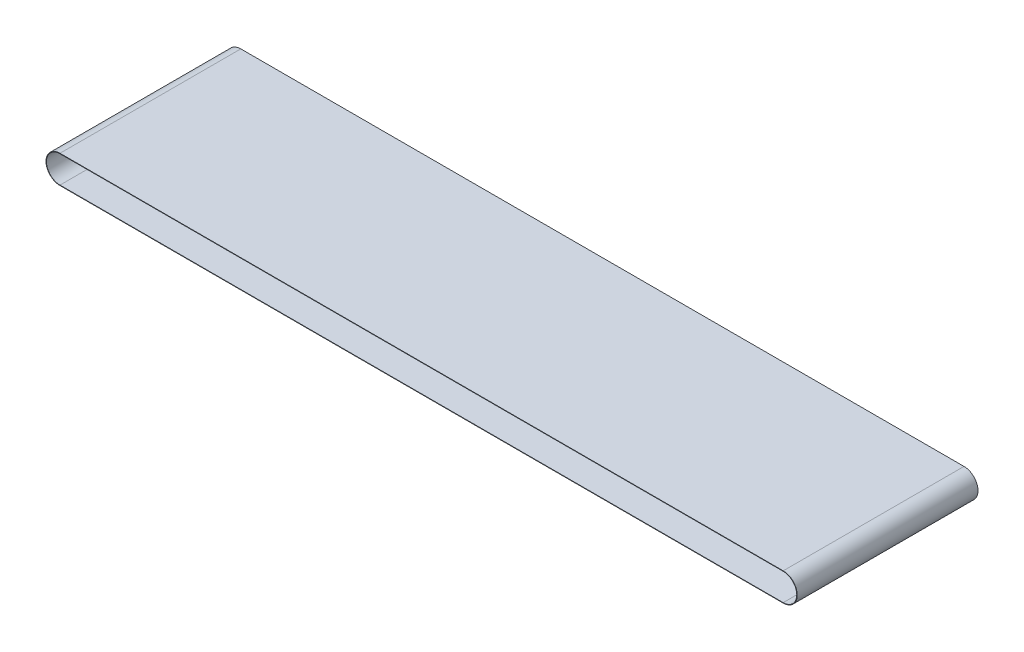
ISO-10303-21;
HEADER;
FILE_DESCRIPTION(('STEP AP214'),'2;1');
FILE_NAME('part.step','',(''),(''),'','','');
FILE_SCHEMA(('AUTOMOTIVE_DESIGN { 1 0 10303 214 1 1 1 1 }'));
ENDSEC;
DATA;
#1=APPLICATION_CONTEXT('core data for automotive mechanical design processes');
#2=APPLICATION_PROTOCOL_DEFINITION('international standard','automotive_design',2000,#1);
#3=PRODUCT_CONTEXT('',#1,'mechanical');
#4=PRODUCT('Part','Part','',(#3));
#5=PRODUCT_RELATED_PRODUCT_CATEGORY('part','',(#4));
#6=PRODUCT_DEFINITION_FORMATION('','',#4);
#7=PRODUCT_DEFINITION_CONTEXT('part definition',#1,'design');
#8=PRODUCT_DEFINITION('design','',#6,#7);
#9=PRODUCT_DEFINITION_SHAPE('','',#8);
#10=(LENGTH_UNIT() NAMED_UNIT(*) SI_UNIT(.MILLI.,.METRE.));
#11=(NAMED_UNIT(*) PLANE_ANGLE_UNIT() SI_UNIT($,.RADIAN.));
#12=(NAMED_UNIT(*) SI_UNIT($,.STERADIAN.) SOLID_ANGLE_UNIT());
#13=UNCERTAINTY_MEASURE_WITH_UNIT(LENGTH_MEASURE(1.E-05),#10,'distance_accuracy_value','');
#14=(GEOMETRIC_REPRESENTATION_CONTEXT(3) GLOBAL_UNCERTAINTY_ASSIGNED_CONTEXT((#13)) GLOBAL_UNIT_ASSIGNED_CONTEXT((#10,
#11,#12)) REPRESENTATION_CONTEXT('',''));
#15=CARTESIAN_POINT('',(0.,0.,0.));
#16=DIRECTION('',(0.,0.,1.));
#17=DIRECTION('',(1.,0.,0.));
#18=AXIS2_PLACEMENT_3D('',#15,#16,#17);
#19=CARTESIAN_POINT('',(0.,0.,250.));
#20=DIRECTION('',(0.,0.,1.));
#21=DIRECTION('',(1.,0.,0.));
#22=AXIS2_PLACEMENT_3D('',#19,#20,#21);
#23=PLANE('',#22);
#24=CARTESIAN_POINT('',(0.,0.,250.));
#25=DIRECTION('',(0.,0.,1.));
#26=DIRECTION('',(1.,0.,0.));
#27=AXIS2_PLACEMENT_3D('',#24,#25,#26);
#28=CIRCLE('',#27,38.7);
#29=CARTESIAN_POINT('',(0.,38.7,250.));
#30=VERTEX_POINT('',#29);
#31=CARTESIAN_POINT('',(0.,-38.7,250.));
#32=VERTEX_POINT('',#31);
#33=EDGE_CURVE('E137',#30,#32,#28,.T.);
#34=ORIENTED_EDGE('',*,*,#33,.T.);
#35=DIRECTION('',(1.,0.,0.));
#36=VECTOR('',#35,1.);
#37=CARTESIAN_POINT('',(0.,-38.7,250.));
#38=LINE('',#37,#36);
#39=CARTESIAN_POINT('',(2000.,-38.7,250.));
#40=VERTEX_POINT('',#39);
#41=EDGE_CURVE('E140',#32,#40,#38,.T.);
#42=ORIENTED_EDGE('',*,*,#41,.T.);
#43=CARTESIAN_POINT('',(2000.,0.,250.));
#44=DIRECTION('',(0.,0.,1.));
#45=DIRECTION('',(1.,0.,0.));
#46=AXIS2_PLACEMENT_3D('',#43,#44,#45);
#47=CIRCLE('',#46,38.7);
#48=CARTESIAN_POINT('',(2000.,38.7,250.));
#49=VERTEX_POINT('',#48);
#50=EDGE_CURVE('E143',#40,#49,#47,.T.);
#51=ORIENTED_EDGE('',*,*,#50,.T.);
#52=DIRECTION('',(-1.,0.,0.));
#53=VECTOR('',#52,1.);
#54=CARTESIAN_POINT('',(0.,38.7,250.));
#55=LINE('',#54,#53);
#56=EDGE_CURVE('E145',#49,#30,#55,.T.);
#57=ORIENTED_EDGE('',*,*,#56,.T.);
#58=EDGE_LOOP('',(#34,#42,#51,#57));
#59=FACE_BOUND('',#58,.T.);
#60=DIRECTION('',(1.,0.,0.));
#61=VECTOR('',#60,1.);
#62=CARTESIAN_POINT('',(0.,-37.5,250.));
#63=LINE('',#62,#61);
#64=CARTESIAN_POINT('',(0.,-37.5,250.));
#65=VERTEX_POINT('',#64);
#66=CARTESIAN_POINT('',(2000.,-37.5,250.));
#67=VERTEX_POINT('',#66);
#68=EDGE_CURVE('E109',#65,#67,#63,.T.);
#69=ORIENTED_EDGE('',*,*,#68,.F.);
#70=CARTESIAN_POINT('',(0.,0.,250.));
#71=DIRECTION('',(0.,0.,1.));
#72=DIRECTION('',(1.,0.,0.));
#73=AXIS2_PLACEMENT_3D('',#70,#71,#72);
#74=CIRCLE('',#73,37.5);
#75=CARTESIAN_POINT('',(0.,37.5,250.));
#76=VERTEX_POINT('',#75);
#77=EDGE_CURVE('E101',#76,#65,#74,.T.);
#78=ORIENTED_EDGE('',*,*,#77,.F.);
#79=DIRECTION('',(-1.,0.,0.));
#80=VECTOR('',#79,1.);
#81=CARTESIAN_POINT('',(0.,37.5,250.));
#82=LINE('',#81,#80);
#83=CARTESIAN_POINT('',(2000.,37.5,250.));
#84=VERTEX_POINT('',#83);
#85=EDGE_CURVE('E123',#84,#76,#82,.T.);
#86=ORIENTED_EDGE('',*,*,#85,.F.);
#87=CARTESIAN_POINT('',(2000.,0.,250.));
#88=DIRECTION('',(0.,0.,1.));
#89=DIRECTION('',(1.,0.,0.));
#90=AXIS2_PLACEMENT_3D('',#87,#88,#89);
#91=CIRCLE('',#90,37.5);
#92=EDGE_CURVE('E121',#67,#84,#91,.T.);
#93=ORIENTED_EDGE('',*,*,#92,.F.);
#94=EDGE_LOOP('',(#69,#78,#86,#93));
#95=FACE_BOUND('',#94,.T.);
#96=ADVANCED_FACE('F36',(#59,#95),#23,.T.);
#97=CARTESIAN_POINT('',(0.,0.,-250.));
#98=DIRECTION('',(0.,0.,1.));
#99=DIRECTION('',(1.,0.,0.));
#100=AXIS2_PLACEMENT_3D('',#97,#98,#99);
#101=PLANE('',#100);
#102=CARTESIAN_POINT('',(0.,0.,-250.));
#103=DIRECTION('',(0.,0.,1.));
#104=DIRECTION('',(1.,0.,0.));
#105=AXIS2_PLACEMENT_3D('',#102,#103,#104);
#106=CIRCLE('',#105,38.7);
#107=CARTESIAN_POINT('',(0.,38.7,-250.));
#108=VERTEX_POINT('',#107);
#109=CARTESIAN_POINT('',(0.,-38.7,-250.));
#110=VERTEX_POINT('',#109);
#111=EDGE_CURVE('E117',#108,#110,#106,.T.);
#112=ORIENTED_EDGE('',*,*,#111,.F.);
#113=DIRECTION('',(-1.,0.,0.));
#114=VECTOR('',#113,1.);
#115=CARTESIAN_POINT('',(0.,38.7,-250.));
#116=LINE('',#115,#114);
#117=CARTESIAN_POINT('',(2000.,38.7,-250.));
#118=VERTEX_POINT('',#117);
#119=EDGE_CURVE('E141',#118,#108,#116,.T.);
#120=ORIENTED_EDGE('',*,*,#119,.F.);
#121=CARTESIAN_POINT('',(2000.,0.,-250.));
#122=DIRECTION('',(0.,0.,1.));
#123=DIRECTION('',(1.,0.,0.));
#124=AXIS2_PLACEMENT_3D('',#121,#122,#123);
#125=CIRCLE('',#124,38.7);
#126=CARTESIAN_POINT('',(2000.,-38.7,-250.));
#127=VERTEX_POINT('',#126);
#128=EDGE_CURVE('E152',#127,#118,#125,.T.);
#129=ORIENTED_EDGE('',*,*,#128,.F.);
#130=DIRECTION('',(1.,0.,0.));
#131=VECTOR('',#130,1.);
#132=CARTESIAN_POINT('',(0.,-38.7,-250.));
#133=LINE('',#132,#131);
#134=EDGE_CURVE('E150',#110,#127,#133,.T.);
#135=ORIENTED_EDGE('',*,*,#134,.F.);
#136=EDGE_LOOP('',(#112,#120,#129,#135));
#137=FACE_BOUND('',#136,.T.);
#138=CARTESIAN_POINT('',(0.,0.,-250.));
#139=DIRECTION('',(0.,0.,1.));
#140=DIRECTION('',(1.,0.,0.));
#141=AXIS2_PLACEMENT_3D('',#138,#139,#140);
#142=CIRCLE('',#141,37.5);
#143=CARTESIAN_POINT('',(0.,37.5,-250.));
#144=VERTEX_POINT('',#143);
#145=CARTESIAN_POINT('',(0.,-37.5,-250.));
#146=VERTEX_POINT('',#145);
#147=EDGE_CURVE('E59',#144,#146,#142,.T.);
#148=ORIENTED_EDGE('',*,*,#147,.T.);
#149=DIRECTION('',(1.,0.,0.));
#150=VECTOR('',#149,1.);
#151=CARTESIAN_POINT('',(0.,-37.5,-250.));
#152=LINE('',#151,#150);
#153=CARTESIAN_POINT('',(2000.,-37.5,-250.));
#154=VERTEX_POINT('',#153);
#155=EDGE_CURVE('E116',#146,#154,#152,.T.);
#156=ORIENTED_EDGE('',*,*,#155,.T.);
#157=CARTESIAN_POINT('',(2000.,0.,-250.));
#158=DIRECTION('',(0.,0.,1.));
#159=DIRECTION('',(1.,0.,0.));
#160=AXIS2_PLACEMENT_3D('',#157,#158,#159);
#161=CIRCLE('',#160,37.5);
#162=CARTESIAN_POINT('',(2000.,37.5,-250.));
#163=VERTEX_POINT('',#162);
#164=EDGE_CURVE('E129',#154,#163,#161,.T.);
#165=ORIENTED_EDGE('',*,*,#164,.T.);
#166=DIRECTION('',(-1.,0.,0.));
#167=VECTOR('',#166,1.);
#168=CARTESIAN_POINT('',(0.,37.5,-250.));
#169=LINE('',#168,#167);
#170=EDGE_CURVE('E110',#163,#144,#169,.T.);
#171=ORIENTED_EDGE('',*,*,#170,.T.);
#172=EDGE_LOOP('',(#148,#156,#165,#171));
#173=FACE_BOUND('',#172,.T.);
#174=ADVANCED_FACE('F170',(#137,#173),#101,.F.);
#175=CARTESIAN_POINT('',(0.,0.,250.));
#176=DIRECTION('',(0.,0.,-1.));
#177=DIRECTION('',(-1.,0.,0.));
#178=AXIS2_PLACEMENT_3D('',#175,#176,#177);
#179=CYLINDRICAL_SURFACE('',#178,38.7);
#180=ORIENTED_EDGE('',*,*,#111,.T.);
#181=DIRECTION('',(0.,0.,-1.));
#182=VECTOR('',#181,1.);
#183=CARTESIAN_POINT('',(0.,-38.7,250.));
#184=LINE('',#183,#182);
#185=EDGE_CURVE('E11',#32,#110,#184,.T.);
#186=ORIENTED_EDGE('',*,*,#185,.F.);
#187=ORIENTED_EDGE('',*,*,#33,.F.);
#188=DIRECTION('',(0.,0.,-1.));
#189=VECTOR('',#188,1.);
#190=CARTESIAN_POINT('',(0.,38.7,250.));
#191=LINE('',#190,#189);
#192=EDGE_CURVE('E147',#30,#108,#191,.T.);
#193=ORIENTED_EDGE('',*,*,#192,.T.);
#194=EDGE_LOOP('',(#180,#186,#187,#193));
#195=FACE_BOUND('',#194,.T.);
#196=ADVANCED_FACE('F38',(#195),#179,.T.);
#197=CARTESIAN_POINT('',(0.,-38.7,250.));
#198=DIRECTION('',(0.,1.,0.));
#199=DIRECTION('',(0.,0.,1.));
#200=AXIS2_PLACEMENT_3D('',#197,#198,#199);
#201=PLANE('',#200);
#202=ORIENTED_EDGE('',*,*,#134,.T.);
#203=DIRECTION('',(0.,0.,-1.));
#204=VECTOR('',#203,1.);
#205=CARTESIAN_POINT('',(2000.,-38.7,250.));
#206=LINE('',#205,#204);
#207=EDGE_CURVE('E44',#40,#127,#206,.T.);
#208=ORIENTED_EDGE('',*,*,#207,.F.);
#209=ORIENTED_EDGE('',*,*,#41,.F.);
#210=ORIENTED_EDGE('',*,*,#185,.T.);
#211=EDGE_LOOP('',(#202,#208,#209,#210));
#212=FACE_BOUND('',#211,.T.);
#213=ADVANCED_FACE('F180',(#212),#201,.F.);
#214=CARTESIAN_POINT('',(2000.,0.,250.));
#215=DIRECTION('',(0.,0.,-1.));
#216=DIRECTION('',(-1.,0.,0.));
#217=AXIS2_PLACEMENT_3D('',#214,#215,#216);
#218=CYLINDRICAL_SURFACE('',#217,38.7);
#219=ORIENTED_EDGE('',*,*,#128,.T.);
#220=DIRECTION('',(0.,0.,-1.));
#221=VECTOR('',#220,1.);
#222=CARTESIAN_POINT('',(2000.,38.7,250.));
#223=LINE('',#222,#221);
#224=EDGE_CURVE('E157',#49,#118,#223,.T.);
#225=ORIENTED_EDGE('',*,*,#224,.F.);
#226=ORIENTED_EDGE('',*,*,#50,.F.);
#227=ORIENTED_EDGE('',*,*,#207,.T.);
#228=EDGE_LOOP('',(#219,#225,#226,#227));
#229=FACE_BOUND('',#228,.T.);
#230=ADVANCED_FACE('F164',(#229),#218,.T.);
#231=CARTESIAN_POINT('',(0.,38.7,250.));
#232=DIRECTION('',(0.,-1.,0.));
#233=DIRECTION('',(0.,0.,-1.));
#234=AXIS2_PLACEMENT_3D('',#231,#232,#233);
#235=PLANE('',#234);
#236=ORIENTED_EDGE('',*,*,#119,.T.);
#237=ORIENTED_EDGE('',*,*,#192,.F.);
#238=ORIENTED_EDGE('',*,*,#56,.F.);
#239=ORIENTED_EDGE('',*,*,#224,.T.);
#240=EDGE_LOOP('',(#236,#237,#238,#239));
#241=FACE_BOUND('',#240,.T.);
#242=ADVANCED_FACE('F174',(#241),#235,.F.);
#243=CARTESIAN_POINT('',(0.,0.,250.));
#244=DIRECTION('',(0.,0.,-1.));
#245=DIRECTION('',(-1.,0.,0.));
#246=AXIS2_PLACEMENT_3D('',#243,#244,#245);
#247=CYLINDRICAL_SURFACE('',#246,37.5);
#248=ORIENTED_EDGE('',*,*,#147,.F.);
#249=DIRECTION('',(0.,0.,-1.));
#250=VECTOR('',#249,1.);
#251=CARTESIAN_POINT('',(0.,37.5,250.));
#252=LINE('',#251,#250);
#253=EDGE_CURVE('E105',#76,#144,#252,.T.);
#254=ORIENTED_EDGE('',*,*,#253,.F.);
#255=ORIENTED_EDGE('',*,*,#77,.T.);
#256=DIRECTION('',(0.,0.,-1.));
#257=VECTOR('',#256,1.);
#258=CARTESIAN_POINT('',(0.,-37.5,250.));
#259=LINE('',#258,#257);
#260=EDGE_CURVE('E104',#65,#146,#259,.T.);
#261=ORIENTED_EDGE('',*,*,#260,.T.);
#262=EDGE_LOOP('',(#248,#254,#255,#261));
#263=FACE_BOUND('',#262,.T.);
#264=ADVANCED_FACE('F103',(#263),#247,.F.);
#265=CARTESIAN_POINT('',(0.,-37.5,250.));
#266=DIRECTION('',(0.,1.,0.));
#267=DIRECTION('',(0.,0.,1.));
#268=AXIS2_PLACEMENT_3D('',#265,#266,#267);
#269=PLANE('',#268);
#270=ORIENTED_EDGE('',*,*,#155,.F.);
#271=ORIENTED_EDGE('',*,*,#260,.F.);
#272=ORIENTED_EDGE('',*,*,#68,.T.);
#273=DIRECTION('',(0.,0.,-1.));
#274=VECTOR('',#273,1.);
#275=CARTESIAN_POINT('',(2000.,-37.5,250.));
#276=LINE('',#275,#274);
#277=EDGE_CURVE('E118',#67,#154,#276,.T.);
#278=ORIENTED_EDGE('',*,*,#277,.T.);
#279=EDGE_LOOP('',(#270,#271,#272,#278));
#280=FACE_BOUND('',#279,.T.);
#281=ADVANCED_FACE('F113',(#280),#269,.T.);
#282=CARTESIAN_POINT('',(2000.,0.,250.));
#283=DIRECTION('',(0.,0.,-1.));
#284=DIRECTION('',(-1.,0.,0.));
#285=AXIS2_PLACEMENT_3D('',#282,#283,#284);
#286=CYLINDRICAL_SURFACE('',#285,37.5);
#287=ORIENTED_EDGE('',*,*,#164,.F.);
#288=ORIENTED_EDGE('',*,*,#277,.F.);
#289=ORIENTED_EDGE('',*,*,#92,.T.);
#290=DIRECTION('',(0.,0.,-1.));
#291=VECTOR('',#290,1.);
#292=CARTESIAN_POINT('',(2000.,37.5,250.));
#293=LINE('',#292,#291);
#294=EDGE_CURVE('E51',#84,#163,#293,.T.);
#295=ORIENTED_EDGE('',*,*,#294,.T.);
#296=EDGE_LOOP('',(#287,#288,#289,#295));
#297=FACE_BOUND('',#296,.T.);
#298=ADVANCED_FACE('F203',(#297),#286,.F.);
#299=CARTESIAN_POINT('',(0.,37.5,250.));
#300=DIRECTION('',(0.,-1.,0.));
#301=DIRECTION('',(0.,0.,-1.));
#302=AXIS2_PLACEMENT_3D('',#299,#300,#301);
#303=PLANE('',#302);
#304=ORIENTED_EDGE('',*,*,#170,.F.);
#305=ORIENTED_EDGE('',*,*,#294,.F.);
#306=ORIENTED_EDGE('',*,*,#85,.T.);
#307=ORIENTED_EDGE('',*,*,#253,.T.);
#308=EDGE_LOOP('',(#304,#305,#306,#307));
#309=FACE_BOUND('',#308,.T.);
#310=ADVANCED_FACE('F207',(#309),#303,.T.);
#311=CLOSED_SHELL('',(#96,#174,#196,#213,#230,#242,#264,#281,#298,#310));
#312=MANIFOLD_SOLID_BREP('B2',#311);
#313=ADVANCED_BREP_SHAPE_REPRESENTATION('',(#18,#312),#14);
#314=SHAPE_DEFINITION_REPRESENTATION(#9,#313);
ENDSEC;
END-ISO-10303-21;
